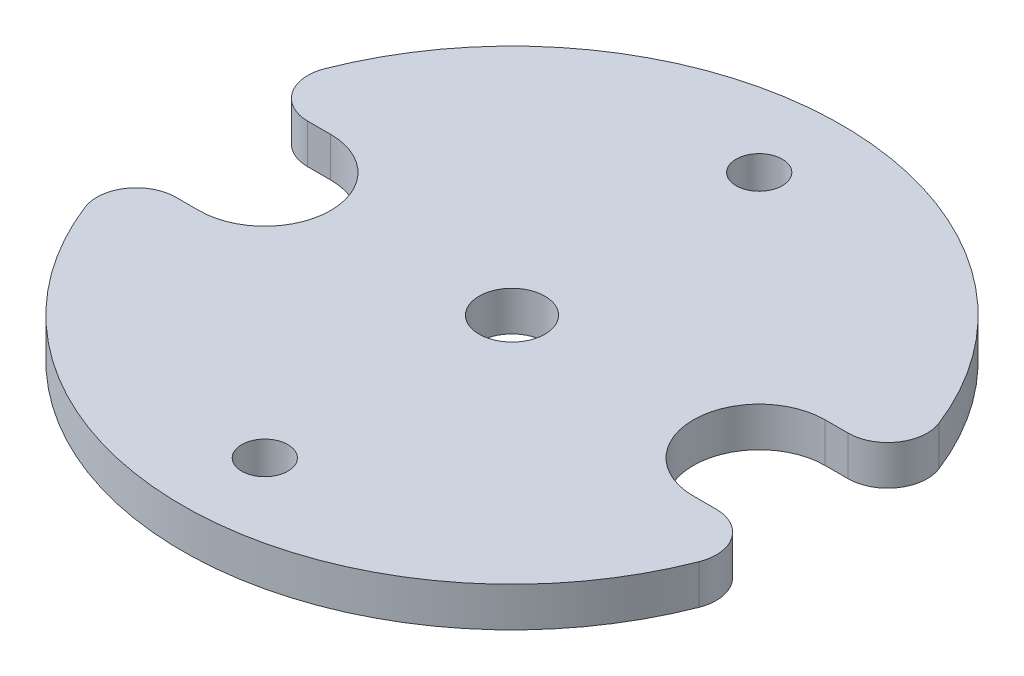
ISO-10303-21;
HEADER;
FILE_DESCRIPTION(('STEP AP214'),'2;1');
FILE_NAME('part.step','',(''),(''),'','','');
FILE_SCHEMA(('AUTOMOTIVE_DESIGN { 1 0 10303 214 1 1 1 1 }'));
ENDSEC;
DATA;
#1=APPLICATION_CONTEXT('core data for automotive mechanical design processes');
#2=APPLICATION_PROTOCOL_DEFINITION('international standard','automotive_design',2000,#1);
#3=PRODUCT_CONTEXT('',#1,'mechanical');
#4=PRODUCT('Part','Part','',(#3));
#5=PRODUCT_RELATED_PRODUCT_CATEGORY('part','',(#4));
#6=PRODUCT_DEFINITION_FORMATION('','',#4);
#7=PRODUCT_DEFINITION_CONTEXT('part definition',#1,'design');
#8=PRODUCT_DEFINITION('design','',#6,#7);
#9=PRODUCT_DEFINITION_SHAPE('','',#8);
#10=(LENGTH_UNIT() NAMED_UNIT(*) SI_UNIT(.MILLI.,.METRE.));
#11=(NAMED_UNIT(*) PLANE_ANGLE_UNIT() SI_UNIT($,.RADIAN.));
#12=(NAMED_UNIT(*) SI_UNIT($,.STERADIAN.) SOLID_ANGLE_UNIT());
#13=UNCERTAINTY_MEASURE_WITH_UNIT(LENGTH_MEASURE(1.E-05),#10,'distance_accuracy_value','');
#14=(GEOMETRIC_REPRESENTATION_CONTEXT(3) GLOBAL_UNCERTAINTY_ASSIGNED_CONTEXT((#13)) GLOBAL_UNIT_ASSIGNED_CONTEXT((#10,
#11,#12)) REPRESENTATION_CONTEXT('',''));
#15=CARTESIAN_POINT('',(0.,0.,0.));
#16=DIRECTION('',(0.,0.,1.));
#17=DIRECTION('',(1.,0.,0.));
#18=AXIS2_PLACEMENT_3D('',#15,#16,#17);
#19=CARTESIAN_POINT('',(11.0339737271533,3.048,7.62631641906364));
#20=DIRECTION('',(0.,-1.,0.));
#21=DIRECTION('',(0.,0.,-1.));
#22=AXIS2_PLACEMENT_3D('',#19,#20,#21);
#23=PLANE('',#22);
#24=CARTESIAN_POINT('',(11.0339737271533,3.048,7.62631641906364));
#25=DIRECTION('',(0.,1.,0.));
#26=DIRECTION('',(0.,0.,-1.));
#27=AXIS2_PLACEMENT_3D('',#24,#25,#26);
#28=CIRCLE('',#27,3.048);
#29=CARTESIAN_POINT('',(13.8733106303029,3.048,8.7346800554273));
#30=VERTEX_POINT('',#29);
#31=CARTESIAN_POINT('',(11.0339737271534,3.048,4.57831641906364));
#32=VERTEX_POINT('',#31);
#33=EDGE_CURVE('E200',#30,#32,#28,.T.);
#34=ORIENTED_EDGE('',*,*,#33,.T.);
#35=DIRECTION('',(-1.,0.,0.));
#36=VECTOR('',#35,1.);
#37=CARTESIAN_POINT('',(9.26216977072345,3.048,4.57831641906363));
#38=LINE('',#37,#36);
#39=CARTESIAN_POINT('',(9.26216977072345,3.048,4.57831641906363));
#40=VERTEX_POINT('',#39);
#41=EDGE_CURVE('E112',#32,#40,#38,.T.);
#42=ORIENTED_EDGE('',*,*,#41,.T.);
#43=CARTESIAN_POINT('',(9.26216977072349,3.048,-0.501683580936376));
#44=DIRECTION('',(0.,-1.,0.));
#45=DIRECTION('',(0.,0.,1.));
#46=AXIS2_PLACEMENT_3D('',#43,#44,#45);
#47=CIRCLE('',#46,5.08);
#48=CARTESIAN_POINT('',(9.26216977072352,3.048,-5.58168358093638));
#49=VERTEX_POINT('',#48);
#50=EDGE_CURVE('E237',#40,#49,#47,.T.);
#51=ORIENTED_EDGE('',*,*,#50,.T.);
#52=DIRECTION('',(1.,0.,0.));
#53=VECTOR('',#52,1.);
#54=CARTESIAN_POINT('',(9.26216977072352,3.048,-5.58168358093638));
#55=LINE('',#54,#53);
#56=CARTESIAN_POINT('',(11.0339737271534,3.048,-5.58168358093637));
#57=VERTEX_POINT('',#56);
#58=EDGE_CURVE('E257',#49,#57,#55,.T.);
#59=ORIENTED_EDGE('',*,*,#58,.T.);
#60=CARTESIAN_POINT('',(11.0339737271534,3.048,-8.62968358093637));
#61=DIRECTION('',(0.,1.,0.));
#62=DIRECTION('',(0.,0.,1.));
#63=AXIS2_PLACEMENT_3D('',#60,#61,#62);
#64=CIRCLE('',#63,3.048);
#65=CARTESIAN_POINT('',(13.873310630303,3.048,-9.73804721729998));
#66=VERTEX_POINT('',#65);
#67=EDGE_CURVE('E253',#57,#66,#64,.T.);
#68=ORIENTED_EDGE('',*,*,#67,.T.);
#69=CARTESIAN_POINT('',(-9.78783022927652,3.048,-0.501683580936509));
#70=DIRECTION('',(0.,1.,0.));
#71=DIRECTION('',(0.,0.,1.));
#72=AXIS2_PLACEMENT_3D('',#69,#70,#71);
#73=CIRCLE('',#72,25.4);
#74=CARTESIAN_POINT('',(-33.4489710888559,3.048,-9.73804721730015));
#75=VERTEX_POINT('',#74);
#76=EDGE_CURVE('E256',#66,#75,#73,.T.);
#77=ORIENTED_EDGE('',*,*,#76,.T.);
#78=CARTESIAN_POINT('',(-30.6096341857064,3.048,-8.62968358093651));
#79=DIRECTION('',(0.,1.,0.));
#80=DIRECTION('',(0.,0.,-1.));
#81=AXIS2_PLACEMENT_3D('',#78,#79,#80);
#82=CIRCLE('',#81,3.048);
#83=CARTESIAN_POINT('',(-30.6096341857064,3.048,-5.58168358093651));
#84=VERTEX_POINT('',#83);
#85=EDGE_CURVE('E261',#75,#84,#82,.T.);
#86=ORIENTED_EDGE('',*,*,#85,.T.);
#87=DIRECTION('',(1.,0.,0.));
#88=VECTOR('',#87,1.);
#89=CARTESIAN_POINT('',(-28.8378302292765,3.048,-5.58168358093651));
#90=LINE('',#89,#88);
#91=CARTESIAN_POINT('',(-28.8378302292765,3.048,-5.58168358093651));
#92=VERTEX_POINT('',#91);
#93=EDGE_CURVE('E268',#84,#92,#90,.T.);
#94=ORIENTED_EDGE('',*,*,#93,.T.);
#95=CARTESIAN_POINT('',(-28.8378302292765,3.048,-0.501683580936509));
#96=DIRECTION('',(0.,-1.,0.));
#97=DIRECTION('',(0.,0.,1.));
#98=AXIS2_PLACEMENT_3D('',#95,#96,#97);
#99=CIRCLE('',#98,5.08);
#100=CARTESIAN_POINT('',(-28.8378302292765,3.048,4.57831641906349));
#101=VERTEX_POINT('',#100);
#102=EDGE_CURVE('E143',#92,#101,#99,.T.);
#103=ORIENTED_EDGE('',*,*,#102,.T.);
#104=DIRECTION('',(-1.,0.,0.));
#105=VECTOR('',#104,1.);
#106=CARTESIAN_POINT('',(-28.8378302292765,3.048,4.57831641906349));
#107=LINE('',#106,#105);
#108=CARTESIAN_POINT('',(-30.6096341857064,3.048,4.57831641906349));
#109=VERTEX_POINT('',#108);
#110=EDGE_CURVE('E137',#101,#109,#107,.T.);
#111=ORIENTED_EDGE('',*,*,#110,.T.);
#112=CARTESIAN_POINT('',(-30.6096341857064,3.048,7.62631641906349));
#113=DIRECTION('',(0.,1.,0.));
#114=DIRECTION('',(0.,0.,1.));
#115=AXIS2_PLACEMENT_3D('',#112,#113,#114);
#116=CIRCLE('',#115,3.048);
#117=CARTESIAN_POINT('',(-33.4489710888559,3.048,8.73468005542713));
#118=VERTEX_POINT('',#117);
#119=EDGE_CURVE('E141',#109,#118,#116,.T.);
#120=ORIENTED_EDGE('',*,*,#119,.T.);
#121=CARTESIAN_POINT('',(-9.78783022927652,3.048,-0.501683580936509));
#122=DIRECTION('',(0.,1.,0.));
#123=DIRECTION('',(0.,0.,1.));
#124=AXIS2_PLACEMENT_3D('',#121,#122,#123);
#125=CIRCLE('',#124,25.4);
#126=EDGE_CURVE('E57',#118,#30,#125,.T.);
#127=ORIENTED_EDGE('',*,*,#126,.T.);
#128=EDGE_LOOP('',(#34,#42,#51,#59,#68,#77,#86,#94,#103,#111,#120,#127));
#129=FACE_BOUND('',#128,.T.);
#130=CARTESIAN_POINT('',(-9.78783022927652,3.048,-19.5516835809365));
#131=DIRECTION('',(0.,1.,0.));
#132=DIRECTION('',(0.,0.,1.));
#133=AXIS2_PLACEMENT_3D('',#130,#131,#132);
#134=CIRCLE('',#133,1.778);
#135=CARTESIAN_POINT('',(-9.78783022927652,3.048,-21.3296835809365));
#136=VERTEX_POINT('',#135);
#137=EDGE_CURVE('E170',#136,#136,#134,.T.);
#138=ORIENTED_EDGE('',*,*,#137,.F.);
#139=EDGE_LOOP('',(#138));
#140=FACE_BOUND('',#139,.T.);
#141=CARTESIAN_POINT('',(-9.78783022927611,3.048,18.5483164190635));
#142=DIRECTION('',(0.,1.,0.));
#143=DIRECTION('',(0.,0.,1.));
#144=AXIS2_PLACEMENT_3D('',#141,#142,#143);
#145=CIRCLE('',#144,1.778);
#146=CARTESIAN_POINT('',(-9.78783022927611,3.048,16.7703164190635));
#147=VERTEX_POINT('',#146);
#148=EDGE_CURVE('E326',#147,#147,#145,.T.);
#149=ORIENTED_EDGE('',*,*,#148,.F.);
#150=EDGE_LOOP('',(#149));
#151=FACE_BOUND('',#150,.T.);
#152=CARTESIAN_POINT('',(-9.78783022927652,3.048,-0.501683580936509));
#153=DIRECTION('',(0.,1.,0.));
#154=DIRECTION('',(0.,0.,1.));
#155=AXIS2_PLACEMENT_3D('',#152,#153,#154);
#156=CIRCLE('',#155,2.54);
#157=CARTESIAN_POINT('',(-9.78783022927652,3.048,-3.04168358093651));
#158=VERTEX_POINT('',#157);
#159=EDGE_CURVE('E315',#158,#158,#156,.T.);
#160=ORIENTED_EDGE('',*,*,#159,.F.);
#161=EDGE_LOOP('',(#160));
#162=FACE_BOUND('',#161,.T.);
#163=ADVANCED_FACE('F39',(#129,#140,#151,#162),#23,.F.);
#164=CARTESIAN_POINT('',(11.0339737271533,0.,7.62631641906364));
#165=DIRECTION('',(0.,-1.,0.));
#166=DIRECTION('',(0.,0.,-1.));
#167=AXIS2_PLACEMENT_3D('',#164,#165,#166);
#168=PLANE('',#167);
#169=CARTESIAN_POINT('',(-9.78783022927611,0.,18.5483164190635));
#170=DIRECTION('',(0.,1.,0.));
#171=DIRECTION('',(0.,0.,1.));
#172=AXIS2_PLACEMENT_3D('',#169,#170,#171);
#173=CIRCLE('',#172,1.778);
#174=CARTESIAN_POINT('',(-9.78783022927611,0.,16.7703164190635));
#175=VERTEX_POINT('',#174);
#176=EDGE_CURVE('E323',#175,#175,#173,.T.);
#177=ORIENTED_EDGE('',*,*,#176,.T.);
#178=EDGE_LOOP('',(#177));
#179=FACE_BOUND('',#178,.T.);
#180=CARTESIAN_POINT('',(11.0339737271533,0.,7.62631641906364));
#181=DIRECTION('',(0.,1.,0.));
#182=DIRECTION('',(0.,0.,-1.));
#183=AXIS2_PLACEMENT_3D('',#180,#181,#182);
#184=CIRCLE('',#183,3.048);
#185=CARTESIAN_POINT('',(13.8733106303029,0.,8.7346800554273));
#186=VERTEX_POINT('',#185);
#187=CARTESIAN_POINT('',(11.0339737271534,0.,4.57831641906364));
#188=VERTEX_POINT('',#187);
#189=EDGE_CURVE('E165',#186,#188,#184,.T.);
#190=ORIENTED_EDGE('',*,*,#189,.F.);
#191=CARTESIAN_POINT('',(-9.78783022927652,0.,-0.501683580936509));
#192=DIRECTION('',(0.,1.,0.));
#193=DIRECTION('',(0.,0.,1.));
#194=AXIS2_PLACEMENT_3D('',#191,#192,#193);
#195=CIRCLE('',#194,25.4);
#196=CARTESIAN_POINT('',(-33.4489710888559,0.,8.73468005542713));
#197=VERTEX_POINT('',#196);
#198=EDGE_CURVE('E104',#197,#186,#195,.T.);
#199=ORIENTED_EDGE('',*,*,#198,.F.);
#200=CARTESIAN_POINT('',(-30.6096341857064,0.,7.62631641906349));
#201=DIRECTION('',(0.,1.,0.));
#202=DIRECTION('',(0.,0.,1.));
#203=AXIS2_PLACEMENT_3D('',#200,#201,#202);
#204=CIRCLE('',#203,3.048);
#205=CARTESIAN_POINT('',(-30.6096341857064,0.,4.57831641906349));
#206=VERTEX_POINT('',#205);
#207=EDGE_CURVE('E98',#206,#197,#204,.T.);
#208=ORIENTED_EDGE('',*,*,#207,.F.);
#209=DIRECTION('',(-1.,0.,0.));
#210=VECTOR('',#209,1.);
#211=CARTESIAN_POINT('',(-28.8378302292765,0.,4.57831641906349));
#212=LINE('',#211,#210);
#213=CARTESIAN_POINT('',(-28.8378302292765,0.,4.57831641906349));
#214=VERTEX_POINT('',#213);
#215=EDGE_CURVE('E152',#214,#206,#212,.T.);
#216=ORIENTED_EDGE('',*,*,#215,.F.);
#217=CARTESIAN_POINT('',(-28.8378302292765,0.,-0.501683580936509));
#218=DIRECTION('',(0.,-1.,0.));
#219=DIRECTION('',(0.,0.,1.));
#220=AXIS2_PLACEMENT_3D('',#217,#218,#219);
#221=CIRCLE('',#220,5.08);
#222=CARTESIAN_POINT('',(-28.8378302292765,0.,-5.58168358093651));
#223=VERTEX_POINT('',#222);
#224=EDGE_CURVE('E191',#223,#214,#221,.T.);
#225=ORIENTED_EDGE('',*,*,#224,.F.);
#226=DIRECTION('',(1.,0.,0.));
#227=VECTOR('',#226,1.);
#228=CARTESIAN_POINT('',(-28.8378302292765,0.,-5.58168358093651));
#229=LINE('',#228,#227);
#230=CARTESIAN_POINT('',(-30.6096341857064,0.,-5.58168358093651));
#231=VERTEX_POINT('',#230);
#232=EDGE_CURVE('E188',#231,#223,#229,.T.);
#233=ORIENTED_EDGE('',*,*,#232,.F.);
#234=CARTESIAN_POINT('',(-30.6096341857064,0.,-8.62968358093651));
#235=DIRECTION('',(0.,1.,0.));
#236=DIRECTION('',(0.,0.,-1.));
#237=AXIS2_PLACEMENT_3D('',#234,#235,#236);
#238=CIRCLE('',#237,3.048);
#239=CARTESIAN_POINT('',(-33.4489710888559,0.,-9.73804721730015));
#240=VERTEX_POINT('',#239);
#241=EDGE_CURVE('E185',#240,#231,#238,.T.);
#242=ORIENTED_EDGE('',*,*,#241,.F.);
#243=CARTESIAN_POINT('',(-9.78783022927652,0.,-0.501683580936509));
#244=DIRECTION('',(0.,1.,0.));
#245=DIRECTION('',(0.,0.,1.));
#246=AXIS2_PLACEMENT_3D('',#243,#244,#245);
#247=CIRCLE('',#246,25.4);
#248=CARTESIAN_POINT('',(13.873310630303,0.,-9.73804721729998));
#249=VERTEX_POINT('',#248);
#250=EDGE_CURVE('E182',#249,#240,#247,.T.);
#251=ORIENTED_EDGE('',*,*,#250,.F.);
#252=CARTESIAN_POINT('',(11.0339737271534,0.,-8.62968358093637));
#253=DIRECTION('',(0.,1.,0.));
#254=DIRECTION('',(0.,0.,1.));
#255=AXIS2_PLACEMENT_3D('',#252,#253,#254);
#256=CIRCLE('',#255,3.048);
#257=CARTESIAN_POINT('',(11.0339737271534,0.,-5.58168358093637));
#258=VERTEX_POINT('',#257);
#259=EDGE_CURVE('E179',#258,#249,#256,.T.);
#260=ORIENTED_EDGE('',*,*,#259,.F.);
#261=DIRECTION('',(1.,0.,0.));
#262=VECTOR('',#261,1.);
#263=CARTESIAN_POINT('',(9.26216977072352,0.,-5.58168358093638));
#264=LINE('',#263,#262);
#265=CARTESIAN_POINT('',(9.26216977072352,0.,-5.58168358093638));
#266=VERTEX_POINT('',#265);
#267=EDGE_CURVE('E176',#266,#258,#264,.T.);
#268=ORIENTED_EDGE('',*,*,#267,.F.);
#269=CARTESIAN_POINT('',(9.26216977072349,0.,-0.501683580936376));
#270=DIRECTION('',(0.,-1.,0.));
#271=DIRECTION('',(0.,0.,1.));
#272=AXIS2_PLACEMENT_3D('',#269,#270,#271);
#273=CIRCLE('',#272,5.08);
#274=CARTESIAN_POINT('',(9.26216977072345,0.,4.57831641906363));
#275=VERTEX_POINT('',#274);
#276=EDGE_CURVE('E173',#275,#266,#273,.T.);
#277=ORIENTED_EDGE('',*,*,#276,.F.);
#278=DIRECTION('',(-1.,0.,0.));
#279=VECTOR('',#278,1.);
#280=CARTESIAN_POINT('',(9.26216977072345,0.,4.57831641906363));
#281=LINE('',#280,#279);
#282=EDGE_CURVE('E169',#188,#275,#281,.T.);
#283=ORIENTED_EDGE('',*,*,#282,.F.);
#284=EDGE_LOOP('',(#190,#199,#208,#216,#225,#233,#242,#251,#260,#268,#277,#283));
#285=FACE_BOUND('',#284,.T.);
#286=CARTESIAN_POINT('',(-9.78783022927652,0.,-19.5516835809365));
#287=DIRECTION('',(0.,1.,0.));
#288=DIRECTION('',(0.,0.,1.));
#289=AXIS2_PLACEMENT_3D('',#286,#287,#288);
#290=CIRCLE('',#289,1.778);
#291=CARTESIAN_POINT('',(-9.78783022927652,0.,-21.3296835809365));
#292=VERTEX_POINT('',#291);
#293=EDGE_CURVE('E330',#292,#292,#290,.T.);
#294=ORIENTED_EDGE('',*,*,#293,.T.);
#295=EDGE_LOOP('',(#294));
#296=FACE_BOUND('',#295,.T.);
#297=CARTESIAN_POINT('',(-9.78783022927652,0.,-0.501683580936509));
#298=DIRECTION('',(0.,1.,0.));
#299=DIRECTION('',(0.,0.,1.));
#300=AXIS2_PLACEMENT_3D('',#297,#298,#299);
#301=CIRCLE('',#300,2.54);
#302=CARTESIAN_POINT('',(-9.78783022927652,0.,-3.04168358093651));
#303=VERTEX_POINT('',#302);
#304=EDGE_CURVE('E318',#303,#303,#301,.T.);
#305=ORIENTED_EDGE('',*,*,#304,.T.);
#306=EDGE_LOOP('',(#305));
#307=FACE_BOUND('',#306,.T.);
#308=ADVANCED_FACE('F241',(#179,#285,#296,#307),#168,.T.);
#309=CARTESIAN_POINT('',(11.0339737271533,3.048,7.62631641906364));
#310=DIRECTION('',(0.,-1.,0.));
#311=DIRECTION('',(0.,0.,-1.));
#312=AXIS2_PLACEMENT_3D('',#309,#310,#311);
#313=CYLINDRICAL_SURFACE('',#312,3.048);
#314=ORIENTED_EDGE('',*,*,#189,.T.);
#315=DIRECTION('',(0.,-1.,0.));
#316=VECTOR('',#315,1.);
#317=CARTESIAN_POINT('',(11.0339737271534,3.048,4.57831641906364));
#318=LINE('',#317,#316);
#319=EDGE_CURVE('E11',#32,#188,#318,.T.);
#320=ORIENTED_EDGE('',*,*,#319,.F.);
#321=ORIENTED_EDGE('',*,*,#33,.F.);
#322=DIRECTION('',(0.,-1.,0.));
#323=VECTOR('',#322,1.);
#324=CARTESIAN_POINT('',(13.8733106303029,3.048,8.7346800554273));
#325=LINE('',#324,#323);
#326=EDGE_CURVE('E161',#30,#186,#325,.T.);
#327=ORIENTED_EDGE('',*,*,#326,.T.);
#328=EDGE_LOOP('',(#314,#320,#321,#327));
#329=FACE_BOUND('',#328,.T.);
#330=ADVANCED_FACE('F41',(#329),#313,.T.);
#331=CARTESIAN_POINT('',(9.26216977072345,3.048,4.57831641906363));
#332=DIRECTION('',(0.,0.,1.));
#333=DIRECTION('',(1.,0.,0.));
#334=AXIS2_PLACEMENT_3D('',#331,#332,#333);
#335=PLANE('',#334);
#336=ORIENTED_EDGE('',*,*,#282,.T.);
#337=DIRECTION('',(0.,-1.,0.));
#338=VECTOR('',#337,1.);
#339=CARTESIAN_POINT('',(9.26216977072345,3.048,4.57831641906363));
#340=LINE('',#339,#338);
#341=EDGE_CURVE('E49',#40,#275,#340,.T.);
#342=ORIENTED_EDGE('',*,*,#341,.F.);
#343=ORIENTED_EDGE('',*,*,#41,.F.);
#344=ORIENTED_EDGE('',*,*,#319,.T.);
#345=EDGE_LOOP('',(#336,#342,#343,#344));
#346=FACE_BOUND('',#345,.T.);
#347=ADVANCED_FACE('F439',(#346),#335,.F.);
#348=CARTESIAN_POINT('',(9.26216977072349,3.048,-0.501683580936376));
#349=DIRECTION('',(0.,-1.,0.));
#350=DIRECTION('',(0.,0.,-1.));
#351=AXIS2_PLACEMENT_3D('',#348,#349,#350);
#352=CYLINDRICAL_SURFACE('',#351,5.08);
#353=ORIENTED_EDGE('',*,*,#276,.T.);
#354=DIRECTION('',(0.,-1.,0.));
#355=VECTOR('',#354,1.);
#356=CARTESIAN_POINT('',(9.26216977072352,3.048,-5.58168358093638));
#357=LINE('',#356,#355);
#358=EDGE_CURVE('E227',#49,#266,#357,.T.);
#359=ORIENTED_EDGE('',*,*,#358,.F.);
#360=ORIENTED_EDGE('',*,*,#50,.F.);
#361=ORIENTED_EDGE('',*,*,#341,.T.);
#362=EDGE_LOOP('',(#353,#359,#360,#361));
#363=FACE_BOUND('',#362,.T.);
#364=ADVANCED_FACE('F235',(#363),#352,.F.);
#365=CARTESIAN_POINT('',(9.26216977072352,3.048,-5.58168358093638));
#366=DIRECTION('',(0.,0.,-1.));
#367=DIRECTION('',(-1.,0.,0.));
#368=AXIS2_PLACEMENT_3D('',#365,#366,#367);
#369=PLANE('',#368);
#370=ORIENTED_EDGE('',*,*,#267,.T.);
#371=DIRECTION('',(0.,-1.,0.));
#372=VECTOR('',#371,1.);
#373=CARTESIAN_POINT('',(11.0339737271534,3.048,-5.58168358093637));
#374=LINE('',#373,#372);
#375=EDGE_CURVE('E223',#57,#258,#374,.T.);
#376=ORIENTED_EDGE('',*,*,#375,.F.);
#377=ORIENTED_EDGE('',*,*,#58,.F.);
#378=ORIENTED_EDGE('',*,*,#358,.T.);
#379=EDGE_LOOP('',(#370,#376,#377,#378));
#380=FACE_BOUND('',#379,.T.);
#381=ADVANCED_FACE('F247',(#380),#369,.F.);
#382=CARTESIAN_POINT('',(11.0339737271534,3.048,-8.62968358093637));
#383=DIRECTION('',(0.,-1.,0.));
#384=DIRECTION('',(0.,0.,-1.));
#385=AXIS2_PLACEMENT_3D('',#382,#383,#384);
#386=CYLINDRICAL_SURFACE('',#385,3.048);
#387=ORIENTED_EDGE('',*,*,#259,.T.);
#388=DIRECTION('',(0.,-1.,0.));
#389=VECTOR('',#388,1.);
#390=CARTESIAN_POINT('',(13.873310630303,3.048,-9.73804721729998));
#391=LINE('',#390,#389);
#392=EDGE_CURVE('E219',#66,#249,#391,.T.);
#393=ORIENTED_EDGE('',*,*,#392,.F.);
#394=ORIENTED_EDGE('',*,*,#67,.F.);
#395=ORIENTED_EDGE('',*,*,#375,.T.);
#396=EDGE_LOOP('',(#387,#393,#394,#395));
#397=FACE_BOUND('',#396,.T.);
#398=ADVANCED_FACE('F251',(#397),#386,.T.);
#399=CARTESIAN_POINT('',(-9.78783022927652,3.048,-0.501683580936509));
#400=DIRECTION('',(0.,-1.,0.));
#401=DIRECTION('',(0.,0.,-1.));
#402=AXIS2_PLACEMENT_3D('',#399,#400,#401);
#403=CYLINDRICAL_SURFACE('',#402,25.4);
#404=ORIENTED_EDGE('',*,*,#250,.T.);
#405=DIRECTION('',(0.,-1.,0.));
#406=VECTOR('',#405,1.);
#407=CARTESIAN_POINT('',(-33.4489710888559,3.048,-9.73804721730015));
#408=LINE('',#407,#406);
#409=EDGE_CURVE('E215',#75,#240,#408,.T.);
#410=ORIENTED_EDGE('',*,*,#409,.F.);
#411=ORIENTED_EDGE('',*,*,#76,.F.);
#412=ORIENTED_EDGE('',*,*,#392,.T.);
#413=EDGE_LOOP('',(#404,#410,#411,#412));
#414=FACE_BOUND('',#413,.T.);
#415=ADVANCED_FACE('F404',(#414),#403,.T.);
#416=CARTESIAN_POINT('',(-30.6096341857064,3.048,-8.62968358093651));
#417=DIRECTION('',(0.,-1.,0.));
#418=DIRECTION('',(0.,0.,-1.));
#419=AXIS2_PLACEMENT_3D('',#416,#417,#418);
#420=CYLINDRICAL_SURFACE('',#419,3.048);
#421=ORIENTED_EDGE('',*,*,#241,.T.);
#422=DIRECTION('',(0.,-1.,0.));
#423=VECTOR('',#422,1.);
#424=CARTESIAN_POINT('',(-30.6096341857064,3.048,-5.58168358093651));
#425=LINE('',#424,#423);
#426=EDGE_CURVE('E211',#84,#231,#425,.T.);
#427=ORIENTED_EDGE('',*,*,#426,.F.);
#428=ORIENTED_EDGE('',*,*,#85,.F.);
#429=ORIENTED_EDGE('',*,*,#409,.T.);
#430=EDGE_LOOP('',(#421,#427,#428,#429));
#431=FACE_BOUND('',#430,.T.);
#432=ADVANCED_FACE('F395',(#431),#420,.T.);
#433=CARTESIAN_POINT('',(-28.8378302292765,3.048,-5.58168358093651));
#434=DIRECTION('',(0.,0.,-1.));
#435=DIRECTION('',(-1.,0.,0.));
#436=AXIS2_PLACEMENT_3D('',#433,#434,#435);
#437=PLANE('',#436);
#438=ORIENTED_EDGE('',*,*,#232,.T.);
#439=DIRECTION('',(0.,-1.,0.));
#440=VECTOR('',#439,1.);
#441=CARTESIAN_POINT('',(-28.8378302292765,3.048,-5.58168358093651));
#442=LINE('',#441,#440);
#443=EDGE_CURVE('E207',#92,#223,#442,.T.);
#444=ORIENTED_EDGE('',*,*,#443,.F.);
#445=ORIENTED_EDGE('',*,*,#93,.F.);
#446=ORIENTED_EDGE('',*,*,#426,.T.);
#447=EDGE_LOOP('',(#438,#444,#445,#446));
#448=FACE_BOUND('',#447,.T.);
#449=ADVANCED_FACE('F276',(#448),#437,.F.);
#450=CARTESIAN_POINT('',(-28.8378302292765,3.048,-0.501683580936509));
#451=DIRECTION('',(0.,-1.,0.));
#452=DIRECTION('',(0.,0.,-1.));
#453=AXIS2_PLACEMENT_3D('',#450,#451,#452);
#454=CYLINDRICAL_SURFACE('',#453,5.08);
#455=ORIENTED_EDGE('',*,*,#224,.T.);
#456=DIRECTION('',(0.,-1.,0.));
#457=VECTOR('',#456,1.);
#458=CARTESIAN_POINT('',(-28.8378302292765,3.048,4.57831641906349));
#459=LINE('',#458,#457);
#460=EDGE_CURVE('E154',#101,#214,#459,.T.);
#461=ORIENTED_EDGE('',*,*,#460,.F.);
#462=ORIENTED_EDGE('',*,*,#102,.F.);
#463=ORIENTED_EDGE('',*,*,#443,.T.);
#464=EDGE_LOOP('',(#455,#461,#462,#463));
#465=FACE_BOUND('',#464,.T.);
#466=ADVANCED_FACE('F280',(#465),#454,.F.);
#467=CARTESIAN_POINT('',(-28.8378302292765,3.048,4.57831641906349));
#468=DIRECTION('',(0.,0.,1.));
#469=DIRECTION('',(1.,0.,0.));
#470=AXIS2_PLACEMENT_3D('',#467,#468,#469);
#471=PLANE('',#470);
#472=ORIENTED_EDGE('',*,*,#215,.T.);
#473=DIRECTION('',(0.,-1.,0.));
#474=VECTOR('',#473,1.);
#475=CARTESIAN_POINT('',(-30.6096341857064,3.048,4.57831641906349));
#476=LINE('',#475,#474);
#477=EDGE_CURVE('E149',#109,#206,#476,.T.);
#478=ORIENTED_EDGE('',*,*,#477,.F.);
#479=ORIENTED_EDGE('',*,*,#110,.F.);
#480=ORIENTED_EDGE('',*,*,#460,.T.);
#481=EDGE_LOOP('',(#472,#478,#479,#480));
#482=FACE_BOUND('',#481,.T.);
#483=ADVANCED_FACE('F150',(#482),#471,.F.);
#484=CARTESIAN_POINT('',(-30.6096341857064,3.048,7.62631641906349));
#485=DIRECTION('',(0.,-1.,0.));
#486=DIRECTION('',(0.,0.,-1.));
#487=AXIS2_PLACEMENT_3D('',#484,#485,#486);
#488=CYLINDRICAL_SURFACE('',#487,3.048);
#489=ORIENTED_EDGE('',*,*,#207,.T.);
#490=DIRECTION('',(0.,-1.,0.));
#491=VECTOR('',#490,1.);
#492=CARTESIAN_POINT('',(-33.4489710888559,3.048,8.73468005542713));
#493=LINE('',#492,#491);
#494=EDGE_CURVE('E155',#118,#197,#493,.T.);
#495=ORIENTED_EDGE('',*,*,#494,.F.);
#496=ORIENTED_EDGE('',*,*,#119,.F.);
#497=ORIENTED_EDGE('',*,*,#477,.T.);
#498=EDGE_LOOP('',(#489,#495,#496,#497));
#499=FACE_BOUND('',#498,.T.);
#500=ADVANCED_FACE('F157',(#499),#488,.T.);
#501=CARTESIAN_POINT('',(-9.78783022927652,3.048,-0.501683580936509));
#502=DIRECTION('',(0.,-1.,0.));
#503=DIRECTION('',(0.,0.,-1.));
#504=AXIS2_PLACEMENT_3D('',#501,#502,#503);
#505=CYLINDRICAL_SURFACE('',#504,25.4);
#506=ORIENTED_EDGE('',*,*,#198,.T.);
#507=ORIENTED_EDGE('',*,*,#326,.F.);
#508=ORIENTED_EDGE('',*,*,#126,.F.);
#509=ORIENTED_EDGE('',*,*,#494,.T.);
#510=EDGE_LOOP('',(#506,#507,#508,#509));
#511=FACE_BOUND('',#510,.T.);
#512=ADVANCED_FACE('F284',(#511),#505,.T.);
#513=CARTESIAN_POINT('',(-9.78783022927652,3.048,-19.5516835809365));
#514=DIRECTION('',(0.,-1.,0.));
#515=DIRECTION('',(0.,0.,-1.));
#516=AXIS2_PLACEMENT_3D('',#513,#514,#515);
#517=CYLINDRICAL_SURFACE('',#516,1.778);
#518=CARTESIAN_POINT('',(-9.78783022927652,3.048,-21.3296835809365));
#519=CARTESIAN_POINT('',(-9.78783022927652,3.01625,-21.3296835809365));
#520=CARTESIAN_POINT('',(-9.78783022927652,2.9845,-21.3296835809365));
#521=CARTESIAN_POINT('',(-9.78783022927652,2.921,-21.3296835809365));
#522=CARTESIAN_POINT('',(-9.78783022927652,2.88925,-21.3296835809365));
#523=CARTESIAN_POINT('',(-9.78783022927652,2.82575,-21.3296835809365));
#524=CARTESIAN_POINT('',(-9.78783022927652,2.794,-21.3296835809365));
#525=CARTESIAN_POINT('',(-9.78783022927652,2.7305,-21.3296835809365));
#526=CARTESIAN_POINT('',(-9.78783022927652,2.69875,-21.3296835809365));
#527=CARTESIAN_POINT('',(-9.78783022927652,2.63525,-21.3296835809365));
#528=CARTESIAN_POINT('',(-9.78783022927652,2.6035,-21.3296835809365));
#529=CARTESIAN_POINT('',(-9.78783022927652,2.54,-21.3296835809365));
#530=CARTESIAN_POINT('',(-9.78783022927652,2.50825,-21.3296835809365));
#531=CARTESIAN_POINT('',(-9.78783022927652,2.44475,-21.3296835809365));
#532=CARTESIAN_POINT('',(-9.78783022927652,2.413,-21.3296835809365));
#533=CARTESIAN_POINT('',(-9.78783022927652,2.3495,-21.3296835809365));
#534=CARTESIAN_POINT('',(-9.78783022927652,2.31775,-21.3296835809365));
#535=CARTESIAN_POINT('',(-9.78783022927652,2.25425,-21.3296835809365));
#536=CARTESIAN_POINT('',(-9.78783022927652,2.2225,-21.3296835809365));
#537=CARTESIAN_POINT('',(-9.78783022927652,2.159,-21.3296835809365));
#538=CARTESIAN_POINT('',(-9.78783022927652,2.12725,-21.3296835809365));
#539=CARTESIAN_POINT('',(-9.78783022927652,2.06375,-21.3296835809365));
#540=CARTESIAN_POINT('',(-9.78783022927652,2.032,-21.3296835809365));
#541=CARTESIAN_POINT('',(-9.78783022927652,1.9685,-21.3296835809365));
#542=CARTESIAN_POINT('',(-9.78783022927652,1.93675,-21.3296835809365));
#543=CARTESIAN_POINT('',(-9.78783022927652,1.87325,-21.3296835809365));
#544=CARTESIAN_POINT('',(-9.78783022927652,1.8415,-21.3296835809365));
#545=CARTESIAN_POINT('',(-9.78783022927652,1.778,-21.3296835809365));
#546=CARTESIAN_POINT('',(-9.78783022927652,1.74625,-21.3296835809365));
#547=CARTESIAN_POINT('',(-9.78783022927652,1.68275,-21.3296835809365));
#548=CARTESIAN_POINT('',(-9.78783022927652,1.651,-21.3296835809365));
#549=CARTESIAN_POINT('',(-9.78783022927652,1.5875,-21.3296835809365));
#550=CARTESIAN_POINT('',(-9.78783022927652,1.55575,-21.3296835809365));
#551=CARTESIAN_POINT('',(-9.78783022927652,1.49225,-21.3296835809365));
#552=CARTESIAN_POINT('',(-9.78783022927652,1.4605,-21.3296835809365));
#553=CARTESIAN_POINT('',(-9.78783022927652,1.397,-21.3296835809365));
#554=CARTESIAN_POINT('',(-9.78783022927652,1.36525,-21.3296835809365));
#555=CARTESIAN_POINT('',(-9.78783022927652,1.30175,-21.3296835809365));
#556=CARTESIAN_POINT('',(-9.78783022927652,1.27,-21.3296835809365));
#557=CARTESIAN_POINT('',(-9.78783022927652,1.2065,-21.3296835809365));
#558=CARTESIAN_POINT('',(-9.78783022927652,1.17475,-21.3296835809365));
#559=CARTESIAN_POINT('',(-9.78783022927652,1.11125,-21.3296835809365));
#560=CARTESIAN_POINT('',(-9.78783022927652,1.0795,-21.3296835809365));
#561=CARTESIAN_POINT('',(-9.78783022927652,1.016,-21.3296835809365));
#562=CARTESIAN_POINT('',(-9.78783022927652,0.98425,-21.3296835809365));
#563=CARTESIAN_POINT('',(-9.78783022927652,0.92075,-21.3296835809365));
#564=CARTESIAN_POINT('',(-9.78783022927652,0.889,-21.3296835809365));
#565=CARTESIAN_POINT('',(-9.78783022927652,0.8255,-21.3296835809365));
#566=CARTESIAN_POINT('',(-9.78783022927652,0.79375,-21.3296835809365));
#567=CARTESIAN_POINT('',(-9.78783022927652,0.73025,-21.3296835809365));
#568=CARTESIAN_POINT('',(-9.78783022927652,0.6985,-21.3296835809365));
#569=CARTESIAN_POINT('',(-9.78783022927652,0.635,-21.3296835809365));
#570=CARTESIAN_POINT('',(-9.78783022927652,0.60325,-21.3296835809365));
#571=CARTESIAN_POINT('',(-9.78783022927652,0.53975,-21.3296835809365));
#572=CARTESIAN_POINT('',(-9.78783022927652,0.508,-21.3296835809365));
#573=CARTESIAN_POINT('',(-9.78783022927652,0.4445,-21.3296835809365));
#574=CARTESIAN_POINT('',(-9.78783022927652,0.41275,-21.3296835809365));
#575=CARTESIAN_POINT('',(-9.78783022927652,0.34925,-21.3296835809365));
#576=CARTESIAN_POINT('',(-9.78783022927652,0.3175,-21.3296835809365));
#577=CARTESIAN_POINT('',(-9.78783022927652,0.254,-21.3296835809365));
#578=CARTESIAN_POINT('',(-9.78783022927652,0.22225,-21.3296835809365));
#579=CARTESIAN_POINT('',(-9.78783022927652,0.15875,-21.3296835809365));
#580=CARTESIAN_POINT('',(-9.78783022927652,0.127,-21.3296835809365));
#581=CARTESIAN_POINT('',(-9.78783022927652,0.0634999999999999,-21.3296835809365));
#582=CARTESIAN_POINT('',(-9.78783022927652,0.03175,-21.3296835809365));
#583=CARTESIAN_POINT('',(-9.78783022927652,0.,-21.3296835809365));
#584=B_SPLINE_CURVE_WITH_KNOTS('',3,(#518,#519,#520,#521,#522,#523,#524,#525,#526,#527,#528,
#529,#530,#531,#532,#533,#534,#535,#536,#537,#538,#539,#540,#541,#542,#543,#544,#545,#546,#547,
#548,#549,#550,#551,#552,#553,#554,#555,#556,#557,#558,#559,#560,#561,#562,#563,#564,#565,#566,
#567,#568,#569,#570,#571,#572,#573,#574,#575,#576,#577,#578,#579,#580,#581,#582,#583),
.UNSPECIFIED.,.F.,.F.,(4,2,2,2,2,2,2,2,2,2,2,2,2,2,2,2,2,2,2,2,2,2,2,2,2,2,2,2,2,2,2,2,4),(0.,
0.0952500000000003,0.1905,0.28575,0.381,0.47625,0.5715,0.66675,0.762,0.85725,0.9525,1.04775,
1.143,1.23825,1.3335,1.42875,1.524,1.61925,1.7145,1.80975,1.905,2.00025,2.0955,2.19075,2.286,
2.38125,2.4765,2.57175,2.667,2.76225,2.8575,2.95275,3.048),.UNSPECIFIED.);
#585=EDGE_CURVE('BSEAM286',#136,#292,#584,.T.);
#586=ORIENTED_EDGE('',*,*,#137,.T.);
#587=ORIENTED_EDGE('',*,*,#293,.F.);
#588=ORIENTED_EDGE('',*,*,#585,.T.);
#589=ORIENTED_EDGE('',*,*,#585,.F.);
#590=EDGE_LOOP('',(#586,#588,#587,#589));
#591=FACE_BOUND('',#590,.T.);
#592=ADVANCED_FACE('F286',(#591),#517,.F.);
#593=CARTESIAN_POINT('',(-9.78783022927611,3.048,18.5483164190635));
#594=DIRECTION('',(0.,-1.,0.));
#595=DIRECTION('',(0.,0.,-1.));
#596=AXIS2_PLACEMENT_3D('',#593,#594,#595);
#597=CYLINDRICAL_SURFACE('',#596,1.778);
#598=CARTESIAN_POINT('',(-9.78783022927611,3.048,16.7703164190635));
#599=CARTESIAN_POINT('',(-9.78783022927611,3.01625,16.7703164190635));
#600=CARTESIAN_POINT('',(-9.78783022927611,2.9845,16.7703164190635));
#601=CARTESIAN_POINT('',(-9.78783022927611,2.921,16.7703164190635));
#602=CARTESIAN_POINT('',(-9.78783022927611,2.88925,16.7703164190635));
#603=CARTESIAN_POINT('',(-9.78783022927611,2.82575,16.7703164190635));
#604=CARTESIAN_POINT('',(-9.78783022927611,2.794,16.7703164190635));
#605=CARTESIAN_POINT('',(-9.78783022927611,2.7305,16.7703164190635));
#606=CARTESIAN_POINT('',(-9.78783022927611,2.69875,16.7703164190635));
#607=CARTESIAN_POINT('',(-9.78783022927611,2.63525,16.7703164190635));
#608=CARTESIAN_POINT('',(-9.78783022927611,2.6035,16.7703164190635));
#609=CARTESIAN_POINT('',(-9.78783022927611,2.54,16.7703164190635));
#610=CARTESIAN_POINT('',(-9.78783022927611,2.50825,16.7703164190635));
#611=CARTESIAN_POINT('',(-9.78783022927611,2.44475,16.7703164190635));
#612=CARTESIAN_POINT('',(-9.78783022927611,2.413,16.7703164190635));
#613=CARTESIAN_POINT('',(-9.78783022927611,2.3495,16.7703164190635));
#614=CARTESIAN_POINT('',(-9.78783022927611,2.31775,16.7703164190635));
#615=CARTESIAN_POINT('',(-9.78783022927611,2.25425,16.7703164190635));
#616=CARTESIAN_POINT('',(-9.78783022927611,2.2225,16.7703164190635));
#617=CARTESIAN_POINT('',(-9.78783022927611,2.159,16.7703164190635));
#618=CARTESIAN_POINT('',(-9.78783022927611,2.12725,16.7703164190635));
#619=CARTESIAN_POINT('',(-9.78783022927611,2.06375,16.7703164190635));
#620=CARTESIAN_POINT('',(-9.78783022927611,2.032,16.7703164190635));
#621=CARTESIAN_POINT('',(-9.78783022927611,1.9685,16.7703164190635));
#622=CARTESIAN_POINT('',(-9.78783022927611,1.93675,16.7703164190635));
#623=CARTESIAN_POINT('',(-9.78783022927611,1.87325,16.7703164190635));
#624=CARTESIAN_POINT('',(-9.78783022927611,1.8415,16.7703164190635));
#625=CARTESIAN_POINT('',(-9.78783022927611,1.778,16.7703164190635));
#626=CARTESIAN_POINT('',(-9.78783022927611,1.74625,16.7703164190635));
#627=CARTESIAN_POINT('',(-9.78783022927611,1.68275,16.7703164190635));
#628=CARTESIAN_POINT('',(-9.78783022927611,1.651,16.7703164190635));
#629=CARTESIAN_POINT('',(-9.78783022927611,1.5875,16.7703164190635));
#630=CARTESIAN_POINT('',(-9.78783022927611,1.55575,16.7703164190635));
#631=CARTESIAN_POINT('',(-9.78783022927611,1.49225,16.7703164190635));
#632=CARTESIAN_POINT('',(-9.78783022927611,1.4605,16.7703164190635));
#633=CARTESIAN_POINT('',(-9.78783022927611,1.397,16.7703164190635));
#634=CARTESIAN_POINT('',(-9.78783022927611,1.36525,16.7703164190635));
#635=CARTESIAN_POINT('',(-9.78783022927611,1.30175,16.7703164190635));
#636=CARTESIAN_POINT('',(-9.78783022927611,1.27,16.7703164190635));
#637=CARTESIAN_POINT('',(-9.78783022927611,1.2065,16.7703164190635));
#638=CARTESIAN_POINT('',(-9.78783022927611,1.17475,16.7703164190635));
#639=CARTESIAN_POINT('',(-9.78783022927611,1.11125,16.7703164190635));
#640=CARTESIAN_POINT('',(-9.78783022927611,1.0795,16.7703164190635));
#641=CARTESIAN_POINT('',(-9.78783022927611,1.016,16.7703164190635));
#642=CARTESIAN_POINT('',(-9.78783022927611,0.98425,16.7703164190635));
#643=CARTESIAN_POINT('',(-9.78783022927611,0.92075,16.7703164190635));
#644=CARTESIAN_POINT('',(-9.78783022927611,0.889,16.7703164190635));
#645=CARTESIAN_POINT('',(-9.78783022927611,0.8255,16.7703164190635));
#646=CARTESIAN_POINT('',(-9.78783022927611,0.79375,16.7703164190635));
#647=CARTESIAN_POINT('',(-9.78783022927611,0.73025,16.7703164190635));
#648=CARTESIAN_POINT('',(-9.78783022927611,0.6985,16.7703164190635));
#649=CARTESIAN_POINT('',(-9.78783022927611,0.635,16.7703164190635));
#650=CARTESIAN_POINT('',(-9.78783022927611,0.60325,16.7703164190635));
#651=CARTESIAN_POINT('',(-9.78783022927611,0.53975,16.7703164190635));
#652=CARTESIAN_POINT('',(-9.78783022927611,0.508,16.7703164190635));
#653=CARTESIAN_POINT('',(-9.78783022927611,0.4445,16.7703164190635));
#654=CARTESIAN_POINT('',(-9.78783022927611,0.41275,16.7703164190635));
#655=CARTESIAN_POINT('',(-9.78783022927611,0.34925,16.7703164190635));
#656=CARTESIAN_POINT('',(-9.78783022927611,0.3175,16.7703164190635));
#657=CARTESIAN_POINT('',(-9.78783022927611,0.254,16.7703164190635));
#658=CARTESIAN_POINT('',(-9.78783022927611,0.22225,16.7703164190635));
#659=CARTESIAN_POINT('',(-9.78783022927611,0.15875,16.7703164190635));
#660=CARTESIAN_POINT('',(-9.78783022927611,0.127,16.7703164190635));
#661=CARTESIAN_POINT('',(-9.78783022927611,0.0634999999999999,16.7703164190635));
#662=CARTESIAN_POINT('',(-9.78783022927611,0.03175,16.7703164190635));
#663=CARTESIAN_POINT('',(-9.78783022927611,0.,16.7703164190635));
#664=B_SPLINE_CURVE_WITH_KNOTS('',3,(#598,#599,#600,#601,#602,#603,#604,#605,#606,#607,#608,
#609,#610,#611,#612,#613,#614,#615,#616,#617,#618,#619,#620,#621,#622,#623,#624,#625,#626,#627,
#628,#629,#630,#631,#632,#633,#634,#635,#636,#637,#638,#639,#640,#641,#642,#643,#644,#645,#646,
#647,#648,#649,#650,#651,#652,#653,#654,#655,#656,#657,#658,#659,#660,#661,#662,#663),
.UNSPECIFIED.,.F.,.F.,(4,2,2,2,2,2,2,2,2,2,2,2,2,2,2,2,2,2,2,2,2,2,2,2,2,2,2,2,2,2,2,2,4),(0.,
0.0952500000000003,0.1905,0.28575,0.381,0.47625,0.5715,0.66675,0.762,0.85725,0.9525,1.04775,
1.143,1.23825,1.3335,1.42875,1.524,1.61925,1.7145,1.80975,1.905,2.00025,2.0955,2.19075,2.286,
2.38125,2.4765,2.57175,2.667,2.76225,2.8575,2.95275,3.048),.UNSPECIFIED.);
#665=EDGE_CURVE('BSEAM292',#147,#175,#664,.T.);
#666=ORIENTED_EDGE('',*,*,#148,.T.);
#667=ORIENTED_EDGE('',*,*,#176,.F.);
#668=ORIENTED_EDGE('',*,*,#665,.T.);
#669=ORIENTED_EDGE('',*,*,#665,.F.);
#670=EDGE_LOOP('',(#666,#668,#667,#669));
#671=FACE_BOUND('',#670,.T.);
#672=ADVANCED_FACE('F292',(#671),#597,.F.);
#673=CARTESIAN_POINT('',(-9.78783022927652,3.048,-0.501683580936509));
#674=DIRECTION('',(0.,-1.,0.));
#675=DIRECTION('',(0.,0.,-1.));
#676=AXIS2_PLACEMENT_3D('',#673,#674,#675);
#677=CYLINDRICAL_SURFACE('',#676,2.54);
#678=CARTESIAN_POINT('',(-9.78783022927652,3.048,-3.04168358093651));
#679=CARTESIAN_POINT('',(-9.78783022927652,3.01625,-3.04168358093651));
#680=CARTESIAN_POINT('',(-9.78783022927652,2.9845,-3.04168358093651));
#681=CARTESIAN_POINT('',(-9.78783022927652,2.921,-3.04168358093651));
#682=CARTESIAN_POINT('',(-9.78783022927652,2.88925,-3.04168358093651));
#683=CARTESIAN_POINT('',(-9.78783022927652,2.82575,-3.04168358093651));
#684=CARTESIAN_POINT('',(-9.78783022927652,2.794,-3.04168358093651));
#685=CARTESIAN_POINT('',(-9.78783022927652,2.7305,-3.04168358093651));
#686=CARTESIAN_POINT('',(-9.78783022927652,2.69875,-3.04168358093651));
#687=CARTESIAN_POINT('',(-9.78783022927652,2.63525,-3.04168358093651));
#688=CARTESIAN_POINT('',(-9.78783022927652,2.6035,-3.04168358093651));
#689=CARTESIAN_POINT('',(-9.78783022927652,2.54,-3.04168358093651));
#690=CARTESIAN_POINT('',(-9.78783022927652,2.50825,-3.04168358093651));
#691=CARTESIAN_POINT('',(-9.78783022927652,2.44475,-3.04168358093651));
#692=CARTESIAN_POINT('',(-9.78783022927652,2.413,-3.04168358093651));
#693=CARTESIAN_POINT('',(-9.78783022927652,2.3495,-3.04168358093651));
#694=CARTESIAN_POINT('',(-9.78783022927652,2.31775,-3.04168358093651));
#695=CARTESIAN_POINT('',(-9.78783022927652,2.25425,-3.04168358093651));
#696=CARTESIAN_POINT('',(-9.78783022927652,2.2225,-3.04168358093651));
#697=CARTESIAN_POINT('',(-9.78783022927652,2.159,-3.04168358093651));
#698=CARTESIAN_POINT('',(-9.78783022927652,2.12725,-3.04168358093651));
#699=CARTESIAN_POINT('',(-9.78783022927652,2.06375,-3.04168358093651));
#700=CARTESIAN_POINT('',(-9.78783022927652,2.032,-3.04168358093651));
#701=CARTESIAN_POINT('',(-9.78783022927652,1.9685,-3.04168358093651));
#702=CARTESIAN_POINT('',(-9.78783022927652,1.93675,-3.04168358093651));
#703=CARTESIAN_POINT('',(-9.78783022927652,1.87325,-3.04168358093651));
#704=CARTESIAN_POINT('',(-9.78783022927652,1.8415,-3.04168358093651));
#705=CARTESIAN_POINT('',(-9.78783022927652,1.778,-3.04168358093651));
#706=CARTESIAN_POINT('',(-9.78783022927652,1.74625,-3.04168358093651));
#707=CARTESIAN_POINT('',(-9.78783022927652,1.68275,-3.04168358093651));
#708=CARTESIAN_POINT('',(-9.78783022927652,1.651,-3.04168358093651));
#709=CARTESIAN_POINT('',(-9.78783022927652,1.5875,-3.04168358093651));
#710=CARTESIAN_POINT('',(-9.78783022927652,1.55575,-3.04168358093651));
#711=CARTESIAN_POINT('',(-9.78783022927652,1.49225,-3.04168358093651));
#712=CARTESIAN_POINT('',(-9.78783022927652,1.4605,-3.04168358093651));
#713=CARTESIAN_POINT('',(-9.78783022927652,1.397,-3.04168358093651));
#714=CARTESIAN_POINT('',(-9.78783022927652,1.36525,-3.04168358093651));
#715=CARTESIAN_POINT('',(-9.78783022927652,1.30175,-3.04168358093651));
#716=CARTESIAN_POINT('',(-9.78783022927652,1.27,-3.04168358093651));
#717=CARTESIAN_POINT('',(-9.78783022927652,1.2065,-3.04168358093651));
#718=CARTESIAN_POINT('',(-9.78783022927652,1.17475,-3.04168358093651));
#719=CARTESIAN_POINT('',(-9.78783022927652,1.11125,-3.04168358093651));
#720=CARTESIAN_POINT('',(-9.78783022927652,1.0795,-3.04168358093651));
#721=CARTESIAN_POINT('',(-9.78783022927652,1.016,-3.04168358093651));
#722=CARTESIAN_POINT('',(-9.78783022927652,0.98425,-3.04168358093651));
#723=CARTESIAN_POINT('',(-9.78783022927652,0.92075,-3.04168358093651));
#724=CARTESIAN_POINT('',(-9.78783022927652,0.889,-3.04168358093651));
#725=CARTESIAN_POINT('',(-9.78783022927652,0.8255,-3.04168358093651));
#726=CARTESIAN_POINT('',(-9.78783022927652,0.79375,-3.04168358093651));
#727=CARTESIAN_POINT('',(-9.78783022927652,0.73025,-3.04168358093651));
#728=CARTESIAN_POINT('',(-9.78783022927652,0.6985,-3.04168358093651));
#729=CARTESIAN_POINT('',(-9.78783022927652,0.635,-3.04168358093651));
#730=CARTESIAN_POINT('',(-9.78783022927652,0.60325,-3.04168358093651));
#731=CARTESIAN_POINT('',(-9.78783022927652,0.53975,-3.04168358093651));
#732=CARTESIAN_POINT('',(-9.78783022927652,0.508,-3.04168358093651));
#733=CARTESIAN_POINT('',(-9.78783022927652,0.4445,-3.04168358093651));
#734=CARTESIAN_POINT('',(-9.78783022927652,0.41275,-3.04168358093651));
#735=CARTESIAN_POINT('',(-9.78783022927652,0.34925,-3.04168358093651));
#736=CARTESIAN_POINT('',(-9.78783022927652,0.3175,-3.04168358093651));
#737=CARTESIAN_POINT('',(-9.78783022927652,0.254,-3.04168358093651));
#738=CARTESIAN_POINT('',(-9.78783022927652,0.22225,-3.04168358093651));
#739=CARTESIAN_POINT('',(-9.78783022927652,0.15875,-3.04168358093651));
#740=CARTESIAN_POINT('',(-9.78783022927652,0.127,-3.04168358093651));
#741=CARTESIAN_POINT('',(-9.78783022927652,0.0634999999999999,-3.04168358093651));
#742=CARTESIAN_POINT('',(-9.78783022927652,0.03175,-3.04168358093651));
#743=CARTESIAN_POINT('',(-9.78783022927652,0.,-3.04168358093651));
#744=B_SPLINE_CURVE_WITH_KNOTS('',3,(#678,#679,#680,#681,#682,#683,#684,#685,#686,#687,#688,
#689,#690,#691,#692,#693,#694,#695,#696,#697,#698,#699,#700,#701,#702,#703,#704,#705,#706,#707,
#708,#709,#710,#711,#712,#713,#714,#715,#716,#717,#718,#719,#720,#721,#722,#723,#724,#725,#726,
#727,#728,#729,#730,#731,#732,#733,#734,#735,#736,#737,#738,#739,#740,#741,#742,#743),
.UNSPECIFIED.,.F.,.F.,(4,2,2,2,2,2,2,2,2,2,2,2,2,2,2,2,2,2,2,2,2,2,2,2,2,2,2,2,2,2,2,2,4),(0.,
0.0952499999999998,0.1905,0.28575,0.381,0.47625,0.5715,0.66675,0.762,0.85725,0.9525,1.04775,
1.143,1.23825,1.3335,1.42875,1.524,1.61925,1.7145,1.80975,1.905,2.00025,2.0955,2.19075,2.286,
2.38125,2.4765,2.57175,2.667,2.76225,2.8575,2.95275,3.048),.UNSPECIFIED.);
#745=EDGE_CURVE('BSEAM306',#158,#303,#744,.T.);
#746=ORIENTED_EDGE('',*,*,#159,.T.);
#747=ORIENTED_EDGE('',*,*,#304,.F.);
#748=ORIENTED_EDGE('',*,*,#745,.T.);
#749=ORIENTED_EDGE('',*,*,#745,.F.);
#750=EDGE_LOOP('',(#746,#748,#747,#749));
#751=FACE_BOUND('',#750,.T.);
#752=ADVANCED_FACE('F306',(#751),#677,.F.);
#753=CLOSED_SHELL('',(#163,#308,#330,#347,#364,#381,#398,#415,#432,#449,#466,#483,#500,#512,
#592,#672,#752));
#754=MANIFOLD_SOLID_BREP('B2',#753);
#755=ADVANCED_BREP_SHAPE_REPRESENTATION('',(#18,#754),#14);
#756=SHAPE_DEFINITION_REPRESENTATION(#9,#755);
ENDSEC;
END-ISO-10303-21;
